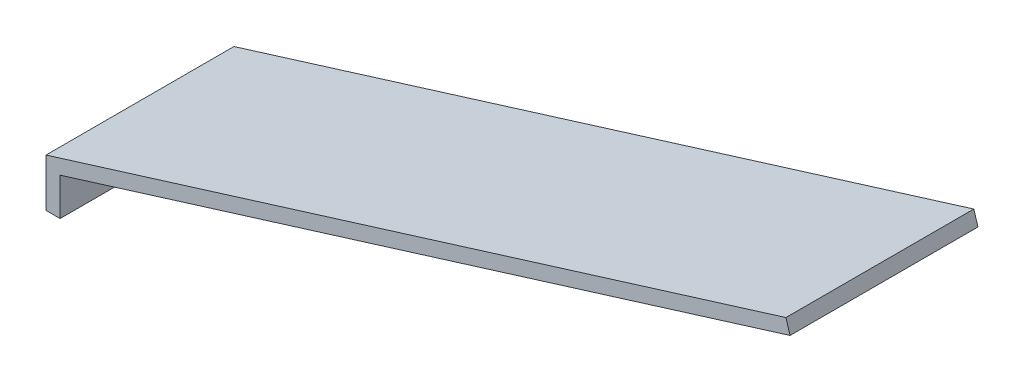
ISO-10303-21;
HEADER;
FILE_DESCRIPTION(('STEP AP214'),'2;1');
FILE_NAME('part.step','',(''),(''),'','','');
FILE_SCHEMA(('AUTOMOTIVE_DESIGN { 1 0 10303 214 1 1 1 1 }'));
ENDSEC;
DATA;
#1=APPLICATION_CONTEXT('core data for automotive mechanical design processes');
#2=APPLICATION_PROTOCOL_DEFINITION('international standard','automotive_design',2000,#1);
#3=PRODUCT_CONTEXT('',#1,'mechanical');
#4=PRODUCT('Part','Part','',(#3));
#5=PRODUCT_RELATED_PRODUCT_CATEGORY('part','',(#4));
#6=PRODUCT_DEFINITION_FORMATION('','',#4);
#7=PRODUCT_DEFINITION_CONTEXT('part definition',#1,'design');
#8=PRODUCT_DEFINITION('design','',#6,#7);
#9=PRODUCT_DEFINITION_SHAPE('','',#8);
#10=(LENGTH_UNIT() NAMED_UNIT(*) SI_UNIT(.MILLI.,.METRE.));
#11=(NAMED_UNIT(*) PLANE_ANGLE_UNIT() SI_UNIT($,.RADIAN.));
#12=(NAMED_UNIT(*) SI_UNIT($,.STERADIAN.) SOLID_ANGLE_UNIT());
#13=UNCERTAINTY_MEASURE_WITH_UNIT(LENGTH_MEASURE(1.E-05),#10,'distance_accuracy_value','');
#14=(GEOMETRIC_REPRESENTATION_CONTEXT(3) GLOBAL_UNCERTAINTY_ASSIGNED_CONTEXT((#13)) GLOBAL_UNIT_ASSIGNED_CONTEXT((#10,
#11,#12)) REPRESENTATION_CONTEXT('',''));
#15=CARTESIAN_POINT('',(0.,0.,0.));
#16=DIRECTION('',(0.,0.,1.));
#17=DIRECTION('',(1.,0.,0.));
#18=AXIS2_PLACEMENT_3D('',#15,#16,#17);
#19=CARTESIAN_POINT('',(0.,0.,2.));
#20=DIRECTION('',(-1.,0.,0.));
#21=DIRECTION('',(0.,0.,1.));
#22=AXIS2_PLACEMENT_3D('',#19,#20,#21);
#23=PLANE('',#22);
#24=DIRECTION('',(0.,0.,1.));
#25=VECTOR('',#24,1.);
#26=CARTESIAN_POINT('',(0.,0.8,2.));
#27=LINE('',#26,#25);
#28=CARTESIAN_POINT('',(0.,0.8,-2.));
#29=VERTEX_POINT('',#28);
#30=CARTESIAN_POINT('',(0.,0.8,2.));
#31=VERTEX_POINT('',#30);
#32=EDGE_CURVE('E26',#29,#31,#27,.T.);
#33=ORIENTED_EDGE('',*,*,#32,.T.);
#34=DIRECTION('',(0.,1.,0.));
#35=VECTOR('',#34,1.);
#36=CARTESIAN_POINT('',(0.,0.,2.));
#37=LINE('',#36,#35);
#38=CARTESIAN_POINT('',(0.,0.,2.));
#39=VERTEX_POINT('',#38);
#40=EDGE_CURVE('E136',#39,#31,#37,.T.);
#41=ORIENTED_EDGE('',*,*,#40,.F.);
#42=DIRECTION('',(0.,0.,-1.));
#43=VECTOR('',#42,1.);
#44=CARTESIAN_POINT('',(0.,0.,2.));
#45=LINE('',#44,#43);
#46=CARTESIAN_POINT('',(0.,0.,-2.));
#47=VERTEX_POINT('',#46);
#48=EDGE_CURVE('E11',#39,#47,#45,.T.);
#49=ORIENTED_EDGE('',*,*,#48,.T.);
#50=DIRECTION('',(0.,-1.,0.));
#51=VECTOR('',#50,1.);
#52=CARTESIAN_POINT('',(0.,0.,-2.));
#53=LINE('',#52,#51);
#54=EDGE_CURVE('E149',#29,#47,#53,.T.);
#55=ORIENTED_EDGE('',*,*,#54,.F.);
#56=EDGE_LOOP('',(#33,#41,#49,#55));
#57=FACE_BOUND('',#56,.T.);
#58=ADVANCED_FACE('F17',(#57),#23,.F.);
#59=CARTESIAN_POINT('',(0.,0.,2.));
#60=DIRECTION('',(0.,1.,0.));
#61=DIRECTION('',(1.,0.,0.));
#62=AXIS2_PLACEMENT_3D('',#59,#60,#61);
#63=PLANE('',#62);
#64=ORIENTED_EDGE('',*,*,#48,.F.);
#65=DIRECTION('',(-1.,0.,0.));
#66=VECTOR('',#65,1.);
#67=CARTESIAN_POINT('',(15.5370790569609,0.,2.));
#68=LINE('',#67,#66);
#69=CARTESIAN_POINT('',(-0.3,0.,2.));
#70=VERTEX_POINT('',#69);
#71=EDGE_CURVE('E72',#39,#70,#68,.T.);
#72=ORIENTED_EDGE('',*,*,#71,.T.);
#73=DIRECTION('',(0.,0.,-1.));
#74=VECTOR('',#73,1.);
#75=CARTESIAN_POINT('',(-0.3,0.,2.));
#76=LINE('',#75,#74);
#77=CARTESIAN_POINT('',(-0.3,0.,-2.));
#78=VERTEX_POINT('',#77);
#79=EDGE_CURVE('E78',#70,#78,#76,.T.);
#80=ORIENTED_EDGE('',*,*,#79,.T.);
#81=DIRECTION('',(-1.,0.,0.));
#82=VECTOR('',#81,1.);
#83=CARTESIAN_POINT('',(0.,0.,-2.));
#84=LINE('',#83,#82);
#85=EDGE_CURVE('E145',#47,#78,#84,.T.);
#86=ORIENTED_EDGE('',*,*,#85,.F.);
#87=EDGE_LOOP('',(#64,#72,#80,#86));
#88=FACE_BOUND('',#87,.T.);
#89=ADVANCED_FACE('F19',(#88),#63,.F.);
#90=CARTESIAN_POINT('',(0.,0.8,2.));
#91=DIRECTION('',(-0.295927265060346,0.955210476174704,0.));
#92=DIRECTION('',(0.,0.,1.));
#93=AXIS2_PLACEMENT_3D('',#90,#91,#92);
#94=PLANE('',#93);
#95=DIRECTION('',(0.,0.,1.));
#96=VECTOR('',#95,1.);
#97=CARTESIAN_POINT('',(15.5370790569609,5.61343685714759,2.));
#98=LINE('',#97,#96);
#99=CARTESIAN_POINT('',(15.5370790569609,5.61343685714759,-2.));
#100=VERTEX_POINT('',#99);
#101=CARTESIAN_POINT('',(15.5370790569609,5.61343685714759,2.));
#102=VERTEX_POINT('',#101);
#103=EDGE_CURVE('E162',#100,#102,#98,.T.);
#104=ORIENTED_EDGE('',*,*,#103,.T.);
#105=DIRECTION('',(-0.955210476174704,-0.295927265060346,0.));
#106=VECTOR('',#105,1.);
#107=CARTESIAN_POINT('',(15.5370790569609,5.61343685714759,2.));
#108=LINE('',#107,#106);
#109=EDGE_CURVE('E140',#102,#31,#108,.T.);
#110=ORIENTED_EDGE('',*,*,#109,.T.);
#111=ORIENTED_EDGE('',*,*,#32,.F.);
#112=DIRECTION('',(-0.955210476174704,-0.295927265060346,0.));
#113=VECTOR('',#112,1.);
#114=CARTESIAN_POINT('',(15.5370790569609,5.61343685714759,-2.));
#115=LINE('',#114,#113);
#116=EDGE_CURVE('E144',#100,#29,#115,.T.);
#117=ORIENTED_EDGE('',*,*,#116,.F.);
#118=EDGE_LOOP('',(#104,#110,#111,#117));
#119=FACE_BOUND('',#118,.T.);
#120=ADVANCED_FACE('F295',(#119),#94,.F.);
#121=CARTESIAN_POINT('',(15.4483008774428,5.9,2.));
#122=DIRECTION('',(-0.955210476174704,-0.295927265060344,0.));
#123=DIRECTION('',(-0.295927265060344,0.955210476174704,0.));
#124=AXIS2_PLACEMENT_3D('',#121,#122,#123);
#125=PLANE('',#124);
#126=DIRECTION('',(0.,0.,1.));
#127=VECTOR('',#126,1.);
#128=CARTESIAN_POINT('',(15.4483008774428,5.9,2.));
#129=LINE('',#128,#127);
#130=CARTESIAN_POINT('',(15.4483008774428,5.9,-2.));
#131=VERTEX_POINT('',#130);
#132=CARTESIAN_POINT('',(15.4483008774428,5.9,2.));
#133=VERTEX_POINT('',#132);
#134=EDGE_CURVE('E115',#131,#133,#129,.T.);
#135=ORIENTED_EDGE('',*,*,#134,.T.);
#136=DIRECTION('',(0.295927265060334,-0.955210476174707,0.));
#137=VECTOR('',#136,1.);
#138=CARTESIAN_POINT('',(15.4483008774428,5.9,2.));
#139=LINE('',#138,#137);
#140=EDGE_CURVE('E104',#133,#102,#139,.T.);
#141=ORIENTED_EDGE('',*,*,#140,.T.);
#142=ORIENTED_EDGE('',*,*,#103,.F.);
#143=DIRECTION('',(0.295927265060334,-0.955210476174707,0.));
#144=VECTOR('',#143,1.);
#145=CARTESIAN_POINT('',(15.4483008774428,5.9,-2.));
#146=LINE('',#145,#144);
#147=EDGE_CURVE('E135',#131,#100,#146,.T.);
#148=ORIENTED_EDGE('',*,*,#147,.F.);
#149=EDGE_LOOP('',(#135,#141,#142,#148));
#150=FACE_BOUND('',#149,.T.);
#151=ADVANCED_FACE('F291',(#150),#125,.F.);
#152=CARTESIAN_POINT('',(15.5370790569609,5.61343685714759,2.));
#153=DIRECTION('',(0.,0.,-1.));
#154=DIRECTION('',(0.,-1.,0.));
#155=AXIS2_PLACEMENT_3D('',#152,#153,#154);
#156=PLANE('',#155);
#157=ORIENTED_EDGE('',*,*,#140,.F.);
#158=DIRECTION('',(-0.955210476174704,-0.295927265060346,0.));
#159=VECTOR('',#158,1.);
#160=CARTESIAN_POINT('',(-0.3,1.02112594632313,2.));
#161=LINE('',#160,#159);
#162=CARTESIAN_POINT('',(-0.3,1.02112594632313,2.));
#163=VERTEX_POINT('',#162);
#164=EDGE_CURVE('E107',#133,#163,#161,.T.);
#165=ORIENTED_EDGE('',*,*,#164,.T.);
#166=DIRECTION('',(0.,-1.,0.));
#167=VECTOR('',#166,1.);
#168=CARTESIAN_POINT('',(-0.3,1.02112594632313,2.));
#169=LINE('',#168,#167);
#170=EDGE_CURVE('E97',#163,#70,#169,.T.);
#171=ORIENTED_EDGE('',*,*,#170,.T.);
#172=ORIENTED_EDGE('',*,*,#71,.F.);
#173=ORIENTED_EDGE('',*,*,#40,.T.);
#174=ORIENTED_EDGE('',*,*,#109,.F.);
#175=EDGE_LOOP('',(#157,#165,#171,#172,#173,#174));
#176=FACE_BOUND('',#175,.T.);
#177=ADVANCED_FACE('F108',(#176),#156,.F.);
#178=CARTESIAN_POINT('',(-0.3,1.02112594632313,2.));
#179=DIRECTION('',(1.,0.,0.));
#180=DIRECTION('',(0.,1.,0.));
#181=AXIS2_PLACEMENT_3D('',#178,#179,#180);
#182=PLANE('',#181);
#183=ORIENTED_EDGE('',*,*,#79,.F.);
#184=ORIENTED_EDGE('',*,*,#170,.F.);
#185=DIRECTION('',(0.,0.,-1.));
#186=VECTOR('',#185,1.);
#187=CARTESIAN_POINT('',(-0.3,1.02112594632313,2.));
#188=LINE('',#187,#186);
#189=CARTESIAN_POINT('',(-0.3,1.02112594632313,-2.));
#190=VERTEX_POINT('',#189);
#191=EDGE_CURVE('E101',#163,#190,#188,.T.);
#192=ORIENTED_EDGE('',*,*,#191,.T.);
#193=DIRECTION('',(0.,1.,0.));
#194=VECTOR('',#193,1.);
#195=CARTESIAN_POINT('',(-0.3,5.61343685714759,-2.));
#196=LINE('',#195,#194);
#197=EDGE_CURVE('E131',#78,#190,#196,.T.);
#198=ORIENTED_EDGE('',*,*,#197,.F.);
#199=EDGE_LOOP('',(#183,#184,#192,#198));
#200=FACE_BOUND('',#199,.T.);
#201=ADVANCED_FACE('F99',(#200),#182,.F.);
#202=CARTESIAN_POINT('',(15.5370790569609,5.61343685714759,-2.));
#203=DIRECTION('',(0.,0.,-1.));
#204=DIRECTION('',(0.,-1.,0.));
#205=AXIS2_PLACEMENT_3D('',#202,#203,#204);
#206=PLANE('',#205);
#207=DIRECTION('',(0.955210476174704,0.295927265060346,0.));
#208=VECTOR('',#207,1.);
#209=CARTESIAN_POINT('',(-0.3,1.02112594632313,-2.));
#210=LINE('',#209,#208);
#211=EDGE_CURVE('E120',#190,#131,#210,.T.);
#212=ORIENTED_EDGE('',*,*,#211,.T.);
#213=ORIENTED_EDGE('',*,*,#147,.T.);
#214=ORIENTED_EDGE('',*,*,#116,.T.);
#215=ORIENTED_EDGE('',*,*,#54,.T.);
#216=ORIENTED_EDGE('',*,*,#85,.T.);
#217=ORIENTED_EDGE('',*,*,#197,.T.);
#218=EDGE_LOOP('',(#212,#213,#214,#215,#216,#217));
#219=FACE_BOUND('',#218,.T.);
#220=ADVANCED_FACE('F272',(#219),#206,.T.);
#221=CARTESIAN_POINT('',(-0.3,1.02112594632313,2.));
#222=DIRECTION('',(0.295927265060346,-0.955210476174704,0.));
#223=DIRECTION('',(0.,0.,-1.));
#224=AXIS2_PLACEMENT_3D('',#221,#222,#223);
#225=PLANE('',#224);
#226=ORIENTED_EDGE('',*,*,#191,.F.);
#227=ORIENTED_EDGE('',*,*,#164,.F.);
#228=ORIENTED_EDGE('',*,*,#134,.F.);
#229=ORIENTED_EDGE('',*,*,#211,.F.);
#230=EDGE_LOOP('',(#226,#227,#228,#229));
#231=FACE_BOUND('',#230,.T.);
#232=ADVANCED_FACE('F118',(#231),#225,.F.);
#233=CLOSED_SHELL('',(#58,#89,#120,#151,#177,#201,#220,#232));
#234=MANIFOLD_SOLID_BREP('B1',#233);
#235=ADVANCED_BREP_SHAPE_REPRESENTATION('',(#18,#234),#14);
#236=SHAPE_DEFINITION_REPRESENTATION(#9,#235);
ENDSEC;
END-ISO-10303-21;
